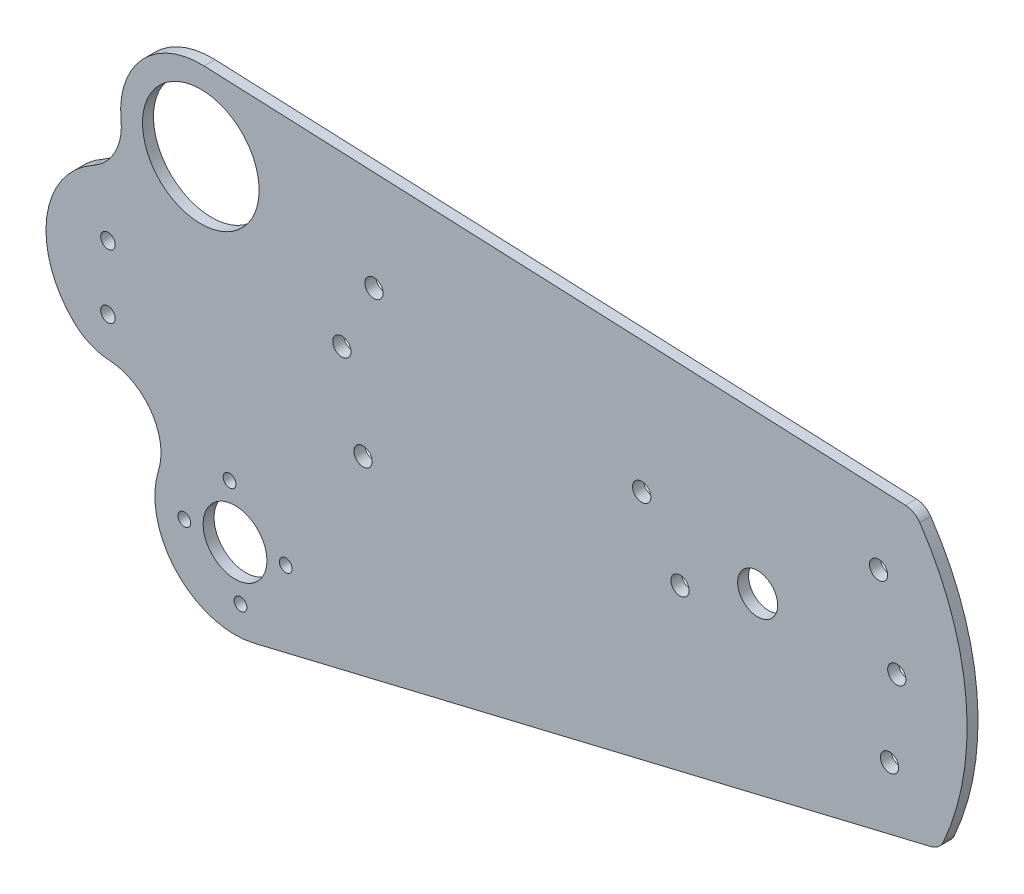
ISO-10303-21;
HEADER;
FILE_DESCRIPTION(('STEP AP214'),'2;1');
FILE_NAME('part.step','',(''),(''),'','','');
FILE_SCHEMA(('AUTOMOTIVE_DESIGN { 1 0 10303 214 1 1 1 1 }'));
ENDSEC;
DATA;
#1=APPLICATION_CONTEXT('core data for automotive mechanical design processes');
#2=APPLICATION_PROTOCOL_DEFINITION('international standard','automotive_design',2000,#1);
#3=PRODUCT_CONTEXT('',#1,'mechanical');
#4=PRODUCT('Part','Part','',(#3));
#5=PRODUCT_RELATED_PRODUCT_CATEGORY('part','',(#4));
#6=PRODUCT_DEFINITION_FORMATION('','',#4);
#7=PRODUCT_DEFINITION_CONTEXT('part definition',#1,'design');
#8=PRODUCT_DEFINITION('design','',#6,#7);
#9=PRODUCT_DEFINITION_SHAPE('','',#8);
#10=(LENGTH_UNIT() NAMED_UNIT(*) SI_UNIT(.MILLI.,.METRE.));
#11=(NAMED_UNIT(*) PLANE_ANGLE_UNIT() SI_UNIT($,.RADIAN.));
#12=(NAMED_UNIT(*) SI_UNIT($,.STERADIAN.) SOLID_ANGLE_UNIT());
#13=UNCERTAINTY_MEASURE_WITH_UNIT(LENGTH_MEASURE(1.E-05),#10,'distance_accuracy_value','');
#14=(GEOMETRIC_REPRESENTATION_CONTEXT(3) GLOBAL_UNCERTAINTY_ASSIGNED_CONTEXT((#13)) GLOBAL_UNIT_ASSIGNED_CONTEXT((#10,
#11,#12)) REPRESENTATION_CONTEXT('',''));
#15=CARTESIAN_POINT('',(0.,0.,0.));
#16=DIRECTION('',(0.,0.,1.));
#17=DIRECTION('',(1.,0.,0.));
#18=AXIS2_PLACEMENT_3D('',#15,#16,#17);
#19=CARTESIAN_POINT('',(1.89364443510684,44.6553291473657,3.));
#20=DIRECTION('',(0.0423677115411601,0.999102085384054,0.));
#21=DIRECTION('',(-0.999102085384054,0.0423677115411601,0.));
#22=AXIS2_PLACEMENT_3D('',#19,#20,#21);
#23=PLANE('',#22);
#24=DIRECTION('',(0.999102085384054,-0.0423677115411601,0.));
#25=VECTOR('',#24,1.);
#26=CARTESIAN_POINT('',(1.89364443510684,44.6553291473657,0.));
#27=LINE('',#26,#25);
#28=CARTESIAN_POINT('',(-111.886028633776,49.4802458784492,0.));
#29=VERTEX_POINT('',#28);
#30=CARTESIAN_POINT('',(80.5949546406806,41.3179380464159,0.));
#31=VERTEX_POINT('',#30);
#32=EDGE_CURVE('E226',#29,#31,#27,.T.);
#33=ORIENTED_EDGE('',*,*,#32,.F.);
#34=DIRECTION('',(0.,0.,-1.));
#35=VECTOR('',#34,1.);
#36=CARTESIAN_POINT('',(-111.886028633776,49.4802458784492,3.));
#37=LINE('',#36,#35);
#38=CARTESIAN_POINT('',(-111.886028633776,49.4802458784492,3.));
#39=VERTEX_POINT('',#38);
#40=EDGE_CURVE('E11',#39,#29,#37,.T.);
#41=ORIENTED_EDGE('',*,*,#40,.F.);
#42=DIRECTION('',(0.999102085384054,-0.0423677115411601,0.));
#43=VECTOR('',#42,1.);
#44=CARTESIAN_POINT('',(1.89364443510684,44.6553291473657,3.));
#45=LINE('',#44,#43);
#46=CARTESIAN_POINT('',(80.5949546406806,41.3179380464159,3.));
#47=VERTEX_POINT('',#46);
#48=EDGE_CURVE('E330',#39,#47,#45,.T.);
#49=ORIENTED_EDGE('',*,*,#48,.T.);
#50=DIRECTION('',(0.,0.,-1.));
#51=VECTOR('',#50,1.);
#52=CARTESIAN_POINT('',(80.5949546406806,41.3179380464159,3.));
#53=LINE('',#52,#51);
#54=EDGE_CURVE('E102',#47,#31,#53,.T.);
#55=ORIENTED_EDGE('',*,*,#54,.T.);
#56=EDGE_LOOP('',(#33,#41,#49,#55));
#57=FACE_BOUND('',#56,.T.);
#58=ADVANCED_FACE('F41',(#57),#23,.T.);
#59=CARTESIAN_POINT('',(-112.818118287682,27.5,3.));
#60=DIRECTION('',(0.,0.,-1.));
#61=DIRECTION('',(-1.,0.,0.));
#62=AXIS2_PLACEMENT_3D('',#59,#60,#61);
#63=CYLINDRICAL_SURFACE('',#62,22.);
#64=CARTESIAN_POINT('',(-112.818118287682,27.5,0.));
#65=DIRECTION('',(0.,0.,1.));
#66=DIRECTION('',(1.,0.,0.));
#67=AXIS2_PLACEMENT_3D('',#64,#65,#66);
#68=CIRCLE('',#67,22.);
#69=CARTESIAN_POINT('',(-134.705774542285,25.2795262486732,0.));
#70=VERTEX_POINT('',#69);
#71=EDGE_CURVE('E230',#29,#70,#68,.T.);
#72=ORIENTED_EDGE('',*,*,#71,.T.);
#73=DIRECTION('',(0.,0.,-1.));
#74=VECTOR('',#73,1.);
#75=CARTESIAN_POINT('',(-134.705774542285,25.2795262486732,3.));
#76=LINE('',#75,#74);
#77=CARTESIAN_POINT('',(-134.705774542285,25.2795262486732,3.));
#78=VERTEX_POINT('',#77);
#79=EDGE_CURVE('E50',#78,#70,#76,.T.);
#80=ORIENTED_EDGE('',*,*,#79,.F.);
#81=CARTESIAN_POINT('',(-112.818118287682,27.5,3.));
#82=DIRECTION('',(0.,0.,1.));
#83=DIRECTION('',(1.,0.,0.));
#84=AXIS2_PLACEMENT_3D('',#81,#82,#83);
#85=CIRCLE('',#84,22.);
#86=EDGE_CURVE('E405',#39,#78,#85,.T.);
#87=ORIENTED_EDGE('',*,*,#86,.F.);
#88=ORIENTED_EDGE('',*,*,#40,.T.);
#89=EDGE_LOOP('',(#72,#80,#87,#88));
#90=FACE_BOUND('',#89,.T.);
#91=ADVANCED_FACE('F363',(#90),#63,.T.);
#92=CARTESIAN_POINT('',(-149.62917653406,23.7655668727686,3.));
#93=DIRECTION('',(0.,0.,-1.));
#94=DIRECTION('',(-1.,0.,0.));
#95=AXIS2_PLACEMENT_3D('',#92,#93,#94);
#96=CYLINDRICAL_SURFACE('',#95,15.);
#97=CARTESIAN_POINT('',(-149.62917653406,23.7655668727686,0.));
#98=DIRECTION('',(0.,0.,1.));
#99=DIRECTION('',(1.,0.,0.));
#100=AXIS2_PLACEMENT_3D('',#97,#98,#99);
#101=CIRCLE('',#100,15.);
#102=CARTESIAN_POINT('',(-142.382746132034,10.6320507240518,0.));
#103=VERTEX_POINT('',#102);
#104=EDGE_CURVE('E234',#103,#70,#101,.T.);
#105=ORIENTED_EDGE('',*,*,#104,.F.);
#106=DIRECTION('',(0.,0.,-1.));
#107=VECTOR('',#106,1.);
#108=CARTESIAN_POINT('',(-142.382746132034,10.6320507240518,3.));
#109=LINE('',#108,#107);
#110=CARTESIAN_POINT('',(-142.382746132034,10.6320507240518,3.));
#111=VERTEX_POINT('',#110);
#112=EDGE_CURVE('E351',#111,#103,#109,.T.);
#113=ORIENTED_EDGE('',*,*,#112,.F.);
#114=CARTESIAN_POINT('',(-149.62917653406,23.7655668727686,3.));
#115=DIRECTION('',(0.,0.,1.));
#116=DIRECTION('',(1.,0.,0.));
#117=AXIS2_PLACEMENT_3D('',#114,#115,#116);
#118=CIRCLE('',#117,15.);
#119=EDGE_CURVE('E360',#111,#78,#118,.T.);
#120=ORIENTED_EDGE('',*,*,#119,.T.);
#121=ORIENTED_EDGE('',*,*,#79,.T.);
#122=EDGE_LOOP('',(#105,#113,#120,#121));
#123=FACE_BOUND('',#122,.T.);
#124=ADVANCED_FACE('F358',(#123),#96,.F.);
#125=CARTESIAN_POINT('',(-130.305362128659,-11.2571428571429,3.));
#126=DIRECTION('',(0.,0.,-1.));
#127=DIRECTION('',(-1.,0.,0.));
#128=AXIS2_PLACEMENT_3D('',#125,#126,#127);
#129=CYLINDRICAL_SURFACE('',#128,25.);
#130=CARTESIAN_POINT('',(-130.305362128659,-11.2571428571429,0.));
#131=DIRECTION('',(0.,0.,1.));
#132=DIRECTION('',(1.,0.,0.));
#133=AXIS2_PLACEMENT_3D('',#130,#131,#132);
#134=CIRCLE('',#133,25.);
#135=CARTESIAN_POINT('',(-147.542861296201,-29.3642857142857,0.));
#136=VERTEX_POINT('',#135);
#137=EDGE_CURVE('E238',#103,#136,#134,.T.);
#138=ORIENTED_EDGE('',*,*,#137,.T.);
#139=DIRECTION('',(0.,0.,-1.));
#140=VECTOR('',#139,1.);
#141=CARTESIAN_POINT('',(-147.542861296201,-29.3642857142857,3.));
#142=LINE('',#141,#140);
#143=CARTESIAN_POINT('',(-147.542861296201,-29.3642857142857,3.));
#144=VERTEX_POINT('',#143);
#145=EDGE_CURVE('E347',#144,#136,#142,.T.);
#146=ORIENTED_EDGE('',*,*,#145,.F.);
#147=CARTESIAN_POINT('',(-130.305362128659,-11.2571428571429,3.));
#148=DIRECTION('',(0.,0.,1.));
#149=DIRECTION('',(1.,0.,0.));
#150=AXIS2_PLACEMENT_3D('',#147,#148,#149);
#151=CIRCLE('',#150,25.);
#152=EDGE_CURVE('E382',#111,#144,#151,.T.);
#153=ORIENTED_EDGE('',*,*,#152,.F.);
#154=ORIENTED_EDGE('',*,*,#112,.T.);
#155=EDGE_LOOP('',(#138,#146,#153,#154));
#156=FACE_BOUND('',#155,.T.);
#157=ADVANCED_FACE('F371',(#156),#129,.T.);
#158=CARTESIAN_POINT('',(-137.200361795676,-18.5,3.));
#159=DIRECTION('',(0.,0.,-1.));
#160=DIRECTION('',(-1.,0.,0.));
#161=AXIS2_PLACEMENT_3D('',#158,#159,#160);
#162=CYLINDRICAL_SURFACE('',#161,15.);
#163=CARTESIAN_POINT('',(-137.200361795676,-18.5,0.));
#164=DIRECTION('',(0.,0.,1.));
#165=DIRECTION('',(1.,0.,0.));
#166=AXIS2_PLACEMENT_3D('',#163,#164,#165);
#167=CIRCLE('',#166,15.);
#168=CARTESIAN_POINT('',(-137.970351553493,-33.4802241562955,0.));
#169=VERTEX_POINT('',#168);
#170=EDGE_CURVE('E241',#136,#169,#167,.T.);
#171=ORIENTED_EDGE('',*,*,#170,.T.);
#172=DIRECTION('',(0.,0.,-1.));
#173=VECTOR('',#172,1.);
#174=CARTESIAN_POINT('',(-137.970351553493,-33.4802241562955,3.));
#175=LINE('',#174,#173);
#176=CARTESIAN_POINT('',(-137.970351553493,-33.4802241562955,3.));
#177=VERTEX_POINT('',#176);
#178=EDGE_CURVE('E344',#177,#169,#175,.T.);
#179=ORIENTED_EDGE('',*,*,#178,.F.);
#180=CARTESIAN_POINT('',(-137.200361795676,-18.5,3.));
#181=DIRECTION('',(0.,0.,1.));
#182=DIRECTION('',(1.,0.,0.));
#183=AXIS2_PLACEMENT_3D('',#180,#181,#182);
#184=CIRCLE('',#183,15.);
#185=EDGE_CURVE('E377',#144,#177,#184,.T.);
#186=ORIENTED_EDGE('',*,*,#185,.F.);
#187=ORIENTED_EDGE('',*,*,#145,.T.);
#188=EDGE_LOOP('',(#171,#179,#186,#187));
#189=FACE_BOUND('',#188,.T.);
#190=ADVANCED_FACE('F375',(#189),#162,.T.);
#191=CARTESIAN_POINT('',(-138.740341311309,-48.4604483125909,3.));
#192=DIRECTION('',(0.,0.,-1.));
#193=DIRECTION('',(-1.,0.,0.));
#194=AXIS2_PLACEMENT_3D('',#191,#192,#193);
#195=CYLINDRICAL_SURFACE('',#194,15.);
#196=CARTESIAN_POINT('',(-138.740341311309,-48.4604483125909,0.));
#197=DIRECTION('',(0.,0.,1.));
#198=DIRECTION('',(1.,0.,0.));
#199=AXIS2_PLACEMENT_3D('',#196,#197,#198);
#200=CIRCLE('',#199,15.);
#201=CARTESIAN_POINT('',(-124.422839539333,-52.9336063703251,0.));
#202=VERTEX_POINT('',#201);
#203=EDGE_CURVE('E245',#202,#169,#200,.T.);
#204=ORIENTED_EDGE('',*,*,#203,.F.);
#205=DIRECTION('',(0.,0.,-1.));
#206=VECTOR('',#205,1.);
#207=CARTESIAN_POINT('',(-124.422839539333,-52.9336063703251,3.));
#208=LINE('',#207,#206);
#209=CARTESIAN_POINT('',(-124.422839539333,-52.9336063703251,3.));
#210=VERTEX_POINT('',#209);
#211=EDGE_CURVE('E341',#210,#202,#208,.T.);
#212=ORIENTED_EDGE('',*,*,#211,.F.);
#213=CARTESIAN_POINT('',(-138.740341311309,-48.4604483125909,3.));
#214=DIRECTION('',(0.,0.,1.));
#215=DIRECTION('',(1.,0.,0.));
#216=AXIS2_PLACEMENT_3D('',#213,#214,#215);
#217=CIRCLE('',#216,15.);
#218=EDGE_CURVE('E381',#210,#177,#217,.T.);
#219=ORIENTED_EDGE('',*,*,#218,.T.);
#220=ORIENTED_EDGE('',*,*,#178,.T.);
#221=EDGE_LOOP('',(#204,#212,#219,#220));
#222=FACE_BOUND('',#221,.T.);
#223=ADVANCED_FACE('F423',(#222),#195,.F.);
#224=CARTESIAN_POINT('',(-103.423836940436,-59.4942381883351,3.));
#225=DIRECTION('',(0.,0.,-1.));
#226=DIRECTION('',(-1.,0.,0.));
#227=AXIS2_PLACEMENT_3D('',#224,#225,#226);
#228=CYLINDRICAL_SURFACE('',#227,22.);
#229=CARTESIAN_POINT('',(-103.423836940436,-59.4942381883351,0.));
#230=DIRECTION('',(0.,0.,1.));
#231=DIRECTION('',(1.,0.,0.));
#232=AXIS2_PLACEMENT_3D('',#229,#230,#231);
#233=CIRCLE('',#232,22.);
#234=CARTESIAN_POINT('',(-98.2951635897501,-80.8880856604933,0.));
#235=VERTEX_POINT('',#234);
#236=EDGE_CURVE('E249',#202,#235,#233,.T.);
#237=ORIENTED_EDGE('',*,*,#236,.T.);
#238=DIRECTION('',(0.,0.,-1.));
#239=VECTOR('',#238,1.);
#240=CARTESIAN_POINT('',(-98.2951635897501,-80.8880856604933,3.));
#241=LINE('',#240,#239);
#242=CARTESIAN_POINT('',(-98.2951635897501,-80.8880856604933,3.));
#243=VERTEX_POINT('',#242);
#244=EDGE_CURVE('E337',#243,#235,#241,.T.);
#245=ORIENTED_EDGE('',*,*,#244,.F.);
#246=CARTESIAN_POINT('',(-103.423836940436,-59.4942381883351,3.));
#247=DIRECTION('',(0.,0.,1.));
#248=DIRECTION('',(1.,0.,0.));
#249=AXIS2_PLACEMENT_3D('',#246,#247,#248);
#250=CIRCLE('',#249,22.);
#251=EDGE_CURVE('E386',#210,#243,#250,.T.);
#252=ORIENTED_EDGE('',*,*,#251,.F.);
#253=ORIENTED_EDGE('',*,*,#211,.T.);
#254=EDGE_LOOP('',(#237,#245,#252,#253));
#255=FACE_BOUND('',#254,.T.);
#256=ADVANCED_FACE('F396',(#255),#228,.T.);
#257=CARTESIAN_POINT('',(12.9952908868623,-54.2088084148887,3.));
#258=DIRECTION('',(-0.233121515940252,0.972447612370825,0.));
#259=DIRECTION('',(-0.972447612370825,-0.233121515940252,0.));
#260=AXIS2_PLACEMENT_3D('',#257,#258,#259);
#261=PLANE('',#260);
#262=DIRECTION('',(0.972447612370825,0.233121515940252,0.));
#263=VECTOR('',#262,1.);
#264=CARTESIAN_POINT('',(12.9952908868623,-54.2088084148887,0.));
#265=LINE('',#264,#263);
#266=CARTESIAN_POINT('',(87.5998610393009,-36.3241118319993,0.));
#267=VERTEX_POINT('',#266);
#268=EDGE_CURVE('E252',#235,#267,#265,.T.);
#269=ORIENTED_EDGE('',*,*,#268,.T.);
#270=DIRECTION('',(0.,0.,-1.));
#271=VECTOR('',#270,1.);
#272=CARTESIAN_POINT('',(87.5998610393009,-36.3241118319993,3.));
#273=LINE('',#272,#271);
#274=CARTESIAN_POINT('',(87.5998610393009,-36.3241118319993,3.));
#275=VERTEX_POINT('',#274);
#276=EDGE_CURVE('E148',#275,#267,#273,.T.);
#277=ORIENTED_EDGE('',*,*,#276,.F.);
#278=DIRECTION('',(0.972447612370825,0.233121515940252,0.));
#279=VECTOR('',#278,1.);
#280=CARTESIAN_POINT('',(12.9952908868623,-54.2088084148887,3.));
#281=LINE('',#280,#279);
#282=EDGE_CURVE('E137',#243,#275,#281,.T.);
#283=ORIENTED_EDGE('',*,*,#282,.F.);
#284=ORIENTED_EDGE('',*,*,#244,.T.);
#285=EDGE_LOOP('',(#269,#277,#283,#284));
#286=FACE_BOUND('',#285,.T.);
#287=ADVANCED_FACE('F400',(#286),#261,.F.);
#288=CARTESIAN_POINT('',(86.4342534595996,-31.4618737701452,3.));
#289=DIRECTION('',(0.,0.,-1.));
#290=DIRECTION('',(-1.,0.,0.));
#291=AXIS2_PLACEMENT_3D('',#288,#289,#290);
#292=CYLINDRICAL_SURFACE('',#291,4.99999999999999);
#293=CARTESIAN_POINT('',(86.4342534595996,-31.4618737701452,0.));
#294=DIRECTION('',(0.,0.,1.));
#295=DIRECTION('',(1.,0.,0.));
#296=AXIS2_PLACEMENT_3D('',#293,#294,#295);
#297=CIRCLE('',#296,4.99999999999999);
#298=CARTESIAN_POINT('',(91.,-33.5,0.));
#299=VERTEX_POINT('',#298);
#300=EDGE_CURVE('E146',#267,#299,#297,.T.);
#301=ORIENTED_EDGE('',*,*,#300,.T.);
#302=DIRECTION('',(0.,0.,-1.));
#303=VECTOR('',#302,1.);
#304=CARTESIAN_POINT('',(91.,-33.5,3.));
#305=LINE('',#304,#303);
#306=CARTESIAN_POINT('',(91.,-33.5,3.));
#307=VERTEX_POINT('',#306);
#308=EDGE_CURVE('E143',#307,#299,#305,.T.);
#309=ORIENTED_EDGE('',*,*,#308,.F.);
#310=CARTESIAN_POINT('',(86.4342534595996,-31.4618737701452,3.));
#311=DIRECTION('',(0.,0.,1.));
#312=DIRECTION('',(1.,0.,0.));
#313=AXIS2_PLACEMENT_3D('',#310,#311,#312);
#314=CIRCLE('',#313,4.99999999999999);
#315=EDGE_CURVE('E130',#275,#307,#314,.T.);
#316=ORIENTED_EDGE('',*,*,#315,.F.);
#317=ORIENTED_EDGE('',*,*,#276,.T.);
#318=EDGE_LOOP('',(#301,#309,#316,#317));
#319=FACE_BOUND('',#318,.T.);
#320=ADVANCED_FACE('F144',(#319),#292,.T.);
#321=CARTESIAN_POINT('',(22.6589151875398,-2.99288439458776,3.));
#322=DIRECTION('',(0.,0.,-1.));
#323=DIRECTION('',(-1.,0.,0.));
#324=AXIS2_PLACEMENT_3D('',#321,#322,#323);
#325=CYLINDRICAL_SURFACE('',#324,74.8410848124603);
#326=CARTESIAN_POINT('',(22.6589151875398,-2.99288439458776,0.));
#327=DIRECTION('',(0.,0.,1.));
#328=DIRECTION('',(1.,0.,0.));
#329=AXIS2_PLACEMENT_3D('',#326,#327,#328);
#330=CIRCLE('',#329,74.8410848124603);
#331=CARTESIAN_POINT('',(84.5156550498621,39.1370540044991,0.));
#332=VERTEX_POINT('',#331);
#333=EDGE_CURVE('E95',#299,#332,#330,.T.);
#334=ORIENTED_EDGE('',*,*,#333,.T.);
#335=DIRECTION('',(0.,0.,-1.));
#336=VECTOR('',#335,1.);
#337=CARTESIAN_POINT('',(84.5156550498621,39.1370540044991,3.));
#338=LINE('',#337,#336);
#339=CARTESIAN_POINT('',(84.5156550498621,39.1370540044991,3.));
#340=VERTEX_POINT('',#339);
#341=EDGE_CURVE('E149',#340,#332,#338,.T.);
#342=ORIENTED_EDGE('',*,*,#341,.F.);
#343=CARTESIAN_POINT('',(22.6589151875398,-2.99288439458776,3.));
#344=DIRECTION('',(0.,0.,1.));
#345=DIRECTION('',(1.,0.,0.));
#346=AXIS2_PLACEMENT_3D('',#343,#344,#345);
#347=CIRCLE('',#346,74.8410848124603);
#348=EDGE_CURVE('E135',#307,#340,#347,.T.);
#349=ORIENTED_EDGE('',*,*,#348,.F.);
#350=ORIENTED_EDGE('',*,*,#308,.T.);
#351=EDGE_LOOP('',(#334,#342,#349,#350));
#352=FACE_BOUND('',#351,.T.);
#353=ADVANCED_FACE('F151',(#352),#325,.T.);
#354=CARTESIAN_POINT('',(-101.920751924876,-73.4133162984688,3.));
#355=DIRECTION('',(0.,0.,-1.));
#356=DIRECTION('',(-1.,0.,0.));
#357=AXIS2_PLACEMENT_3D('',#354,#355,#356);
#358=CYLINDRICAL_SURFACE('',#357,1.75);
#359=CARTESIAN_POINT('',(-101.920751924876,-73.4133162984688,3.));
#360=DIRECTION('',(0.,0.,1.));
#361=DIRECTION('',(1.,0.,0.));
#362=AXIS2_PLACEMENT_3D('',#359,#360,#361);
#363=CIRCLE('',#362,1.75);
#364=CARTESIAN_POINT('',(-100.170751924876,-73.4133162984688,3.));
#365=VERTEX_POINT('',#364);
#366=EDGE_CURVE('E218',#365,#365,#363,.T.);
#367=ORIENTED_EDGE('',*,*,#366,.T.);
#368=EDGE_LOOP('',(#367));
#369=FACE_BOUND('',#368,.T.);
#370=CARTESIAN_POINT('',(-101.920751924876,-73.4133162984688,0.));
#371=DIRECTION('',(0.,0.,1.));
#372=DIRECTION('',(1.,0.,0.));
#373=AXIS2_PLACEMENT_3D('',#370,#371,#372);
#374=CIRCLE('',#373,1.75);
#375=CARTESIAN_POINT('',(-100.170751924876,-73.4133162984688,0.));
#376=VERTEX_POINT('',#375);
#377=EDGE_CURVE('E322',#376,#376,#374,.T.);
#378=ORIENTED_EDGE('',*,*,#377,.F.);
#379=EDGE_LOOP('',(#378));
#380=FACE_BOUND('',#379,.T.);
#381=ADVANCED_FACE('F435',(#369,#380),#358,.F.);
#382=CARTESIAN_POINT('',(-89.504758830302,-57.9911531727758,3.));
#383=DIRECTION('',(0.,0.,-1.));
#384=DIRECTION('',(-1.,0.,0.));
#385=AXIS2_PLACEMENT_3D('',#382,#383,#384);
#386=CYLINDRICAL_SURFACE('',#385,1.74999999999997);
#387=CARTESIAN_POINT('',(-89.504758830302,-57.9911531727758,3.));
#388=DIRECTION('',(0.,0.,1.));
#389=DIRECTION('',(1.,0.,0.));
#390=AXIS2_PLACEMENT_3D('',#387,#388,#389);
#391=CIRCLE('',#390,1.74999999999997);
#392=CARTESIAN_POINT('',(-87.754758830302,-57.9911531727758,3.));
#393=VERTEX_POINT('',#392);
#394=EDGE_CURVE('E214',#393,#393,#391,.T.);
#395=ORIENTED_EDGE('',*,*,#394,.T.);
#396=EDGE_LOOP('',(#395));
#397=FACE_BOUND('',#396,.T.);
#398=CARTESIAN_POINT('',(-89.504758830302,-57.9911531727758,0.));
#399=DIRECTION('',(0.,0.,1.));
#400=DIRECTION('',(1.,0.,0.));
#401=AXIS2_PLACEMENT_3D('',#398,#399,#400);
#402=CIRCLE('',#401,1.74999999999997);
#403=CARTESIAN_POINT('',(-87.754758830302,-57.9911531727758,0.));
#404=VERTEX_POINT('',#403);
#405=EDGE_CURVE('E318',#404,#404,#402,.T.);
#406=ORIENTED_EDGE('',*,*,#405,.F.);
#407=EDGE_LOOP('',(#406));
#408=FACE_BOUND('',#407,.T.);
#409=ADVANCED_FACE('F494',(#397,#408),#386,.F.);
#410=CARTESIAN_POINT('',(-104.926921955995,-45.5751600782015,3.));
#411=DIRECTION('',(0.,0.,-1.));
#412=DIRECTION('',(-1.,0.,0.));
#413=AXIS2_PLACEMENT_3D('',#410,#411,#412);
#414=CYLINDRICAL_SURFACE('',#413,1.74999999999998);
#415=CARTESIAN_POINT('',(-104.926921955995,-45.5751600782015,3.));
#416=DIRECTION('',(0.,0.,1.));
#417=DIRECTION('',(1.,0.,0.));
#418=AXIS2_PLACEMENT_3D('',#415,#416,#417);
#419=CIRCLE('',#418,1.74999999999998);
#420=CARTESIAN_POINT('',(-103.176921955995,-45.5751600782015,3.));
#421=VERTEX_POINT('',#420);
#422=EDGE_CURVE('E210',#421,#421,#419,.T.);
#423=ORIENTED_EDGE('',*,*,#422,.T.);
#424=EDGE_LOOP('',(#423));
#425=FACE_BOUND('',#424,.T.);
#426=CARTESIAN_POINT('',(-104.926921955995,-45.5751600782015,0.));
#427=DIRECTION('',(0.,0.,1.));
#428=DIRECTION('',(1.,0.,0.));
#429=AXIS2_PLACEMENT_3D('',#426,#427,#428);
#430=CIRCLE('',#429,1.74999999999998);
#431=CARTESIAN_POINT('',(-103.176921955995,-45.5751600782015,0.));
#432=VERTEX_POINT('',#431);
#433=EDGE_CURVE('E314',#432,#432,#430,.T.);
#434=ORIENTED_EDGE('',*,*,#433,.F.);
#435=EDGE_LOOP('',(#434));
#436=FACE_BOUND('',#435,.T.);
#437=ADVANCED_FACE('F490',(#425,#436),#414,.F.);
#438=CARTESIAN_POINT('',(-103.423836940436,-59.4942381883351,3.));
#439=DIRECTION('',(0.,0.,-1.));
#440=DIRECTION('',(-1.,0.,0.));
#441=AXIS2_PLACEMENT_3D('',#438,#439,#440);
#442=CYLINDRICAL_SURFACE('',#441,8.75000000000001);
#443=CARTESIAN_POINT('',(-103.423836940436,-59.4942381883351,3.));
#444=DIRECTION('',(0.,0.,1.));
#445=DIRECTION('',(1.,0.,0.));
#446=AXIS2_PLACEMENT_3D('',#443,#444,#445);
#447=CIRCLE('',#446,8.75000000000001);
#448=CARTESIAN_POINT('',(-94.6738369404356,-59.4942381883351,3.));
#449=VERTEX_POINT('',#448);
#450=EDGE_CURVE('E206',#449,#449,#447,.T.);
#451=ORIENTED_EDGE('',*,*,#450,.T.);
#452=EDGE_LOOP('',(#451));
#453=FACE_BOUND('',#452,.T.);
#454=CARTESIAN_POINT('',(-103.423836940436,-59.4942381883351,0.));
#455=DIRECTION('',(0.,0.,1.));
#456=DIRECTION('',(1.,0.,0.));
#457=AXIS2_PLACEMENT_3D('',#454,#455,#456);
#458=CIRCLE('',#457,8.75000000000001);
#459=CARTESIAN_POINT('',(-94.6738369404356,-59.4942381883351,0.));
#460=VERTEX_POINT('',#459);
#461=EDGE_CURVE('E310',#460,#460,#458,.T.);
#462=ORIENTED_EDGE('',*,*,#461,.F.);
#463=EDGE_LOOP('',(#462));
#464=FACE_BOUND('',#463,.T.);
#465=ADVANCED_FACE('F486',(#453,#464),#442,.F.);
#466=CARTESIAN_POINT('',(-112.818118287682,27.5,3.));
#467=DIRECTION('',(0.,0.,-1.));
#468=DIRECTION('',(-1.,0.,0.));
#469=AXIS2_PLACEMENT_3D('',#466,#467,#468);
#470=CYLINDRICAL_SURFACE('',#469,16.);
#471=CARTESIAN_POINT('',(-112.818118287682,27.5,3.));
#472=DIRECTION('',(0.,0.,1.));
#473=DIRECTION('',(1.,0.,0.));
#474=AXIS2_PLACEMENT_3D('',#471,#472,#473);
#475=CIRCLE('',#474,16.);
#476=CARTESIAN_POINT('',(-96.8181182876816,27.5,3.));
#477=VERTEX_POINT('',#476);
#478=EDGE_CURVE('E202',#477,#477,#475,.T.);
#479=ORIENTED_EDGE('',*,*,#478,.T.);
#480=EDGE_LOOP('',(#479));
#481=FACE_BOUND('',#480,.T.);
#482=CARTESIAN_POINT('',(-112.818118287682,27.5,0.));
#483=DIRECTION('',(0.,0.,1.));
#484=DIRECTION('',(1.,0.,0.));
#485=AXIS2_PLACEMENT_3D('',#482,#483,#484);
#486=CIRCLE('',#485,16.);
#487=CARTESIAN_POINT('',(-96.8181182876816,27.5,0.));
#488=VERTEX_POINT('',#487);
#489=EDGE_CURVE('E306',#488,#488,#486,.T.);
#490=ORIENTED_EDGE('',*,*,#489,.F.);
#491=EDGE_LOOP('',(#490));
#492=FACE_BOUND('',#491,.T.);
#493=ADVANCED_FACE('F482',(#481,#492),#470,.F.);
#494=CARTESIAN_POINT('',(-68.3,-21.5,3.));
#495=DIRECTION('',(0.,0.,-1.));
#496=DIRECTION('',(-1.,0.,0.));
#497=AXIS2_PLACEMENT_3D('',#494,#495,#496);
#498=CYLINDRICAL_SURFACE('',#497,2.49999999999999);
#499=CARTESIAN_POINT('',(-68.3,-21.5,3.));
#500=DIRECTION('',(0.,0.,1.));
#501=DIRECTION('',(1.,0.,0.));
#502=AXIS2_PLACEMENT_3D('',#499,#500,#501);
#503=CIRCLE('',#502,2.49999999999999);
#504=CARTESIAN_POINT('',(-65.8,-21.5,3.));
#505=VERTEX_POINT('',#504);
#506=EDGE_CURVE('E198',#505,#505,#503,.T.);
#507=ORIENTED_EDGE('',*,*,#506,.T.);
#508=EDGE_LOOP('',(#507));
#509=FACE_BOUND('',#508,.T.);
#510=CARTESIAN_POINT('',(-68.3,-21.5,0.));
#511=DIRECTION('',(0.,0.,1.));
#512=DIRECTION('',(1.,0.,0.));
#513=AXIS2_PLACEMENT_3D('',#510,#511,#512);
#514=CIRCLE('',#513,2.49999999999999);
#515=CARTESIAN_POINT('',(-65.8,-21.5,0.));
#516=VERTEX_POINT('',#515);
#517=EDGE_CURVE('E302',#516,#516,#514,.T.);
#518=ORIENTED_EDGE('',*,*,#517,.F.);
#519=EDGE_LOOP('',(#518));
#520=FACE_BOUND('',#519,.T.);
#521=ADVANCED_FACE('F478',(#509,#520),#498,.F.);
#522=CARTESIAN_POINT('',(-138.3,-5.25000000000004,3.));
#523=DIRECTION('',(0.,0.,-1.));
#524=DIRECTION('',(-1.,0.,0.));
#525=AXIS2_PLACEMENT_3D('',#522,#523,#524);
#526=CYLINDRICAL_SURFACE('',#525,2.);
#527=CARTESIAN_POINT('',(-138.3,-5.25000000000004,3.));
#528=DIRECTION('',(0.,0.,1.));
#529=DIRECTION('',(1.,0.,0.));
#530=AXIS2_PLACEMENT_3D('',#527,#528,#529);
#531=CIRCLE('',#530,2.);
#532=CARTESIAN_POINT('',(-136.3,-5.25000000000004,3.));
#533=VERTEX_POINT('',#532);
#534=EDGE_CURVE('E194',#533,#533,#531,.T.);
#535=ORIENTED_EDGE('',*,*,#534,.T.);
#536=EDGE_LOOP('',(#535));
#537=FACE_BOUND('',#536,.T.);
#538=CARTESIAN_POINT('',(-138.3,-5.25000000000004,0.));
#539=DIRECTION('',(0.,0.,1.));
#540=DIRECTION('',(1.,0.,0.));
#541=AXIS2_PLACEMENT_3D('',#538,#539,#540);
#542=CIRCLE('',#541,2.);
#543=CARTESIAN_POINT('',(-136.3,-5.25000000000004,0.));
#544=VERTEX_POINT('',#543);
#545=EDGE_CURVE('E298',#544,#544,#542,.T.);
#546=ORIENTED_EDGE('',*,*,#545,.F.);
#547=EDGE_LOOP('',(#546));
#548=FACE_BOUND('',#547,.T.);
#549=ADVANCED_FACE('F474',(#537,#548),#526,.F.);
#550=CARTESIAN_POINT('',(-138.3,-22.75,3.));
#551=DIRECTION('',(0.,0.,-1.));
#552=DIRECTION('',(-1.,0.,0.));
#553=AXIS2_PLACEMENT_3D('',#550,#551,#552);
#554=CYLINDRICAL_SURFACE('',#553,2.);
#555=CARTESIAN_POINT('',(-138.3,-22.75,3.));
#556=DIRECTION('',(0.,0.,1.));
#557=DIRECTION('',(1.,0.,0.));
#558=AXIS2_PLACEMENT_3D('',#555,#556,#557);
#559=CIRCLE('',#558,2.);
#560=CARTESIAN_POINT('',(-136.3,-22.75,3.));
#561=VERTEX_POINT('',#560);
#562=EDGE_CURVE('E190',#561,#561,#559,.T.);
#563=ORIENTED_EDGE('',*,*,#562,.T.);
#564=EDGE_LOOP('',(#563));
#565=FACE_BOUND('',#564,.T.);
#566=CARTESIAN_POINT('',(-138.3,-22.75,0.));
#567=DIRECTION('',(0.,0.,1.));
#568=DIRECTION('',(1.,0.,0.));
#569=AXIS2_PLACEMENT_3D('',#566,#567,#568);
#570=CIRCLE('',#569,2.);
#571=CARTESIAN_POINT('',(-136.3,-22.75,0.));
#572=VERTEX_POINT('',#571);
#573=EDGE_CURVE('E294',#572,#572,#570,.T.);
#574=ORIENTED_EDGE('',*,*,#573,.F.);
#575=EDGE_LOOP('',(#574));
#576=FACE_BOUND('',#575,.T.);
#577=ADVANCED_FACE('F470',(#565,#576),#554,.F.);
#578=CARTESIAN_POINT('',(-74.1,1.7,3.));
#579=DIRECTION('',(0.,0.,-1.));
#580=DIRECTION('',(-1.,0.,0.));
#581=AXIS2_PLACEMENT_3D('',#578,#579,#580);
#582=CYLINDRICAL_SURFACE('',#581,2.49999999999999);
#583=CARTESIAN_POINT('',(-74.1,1.7,3.));
#584=DIRECTION('',(0.,0.,1.));
#585=DIRECTION('',(1.,0.,0.));
#586=AXIS2_PLACEMENT_3D('',#583,#584,#585);
#587=CIRCLE('',#586,2.49999999999999);
#588=CARTESIAN_POINT('',(-71.6,1.7,3.));
#589=VERTEX_POINT('',#588);
#590=EDGE_CURVE('E186',#589,#589,#587,.T.);
#591=ORIENTED_EDGE('',*,*,#590,.T.);
#592=EDGE_LOOP('',(#591));
#593=FACE_BOUND('',#592,.T.);
#594=CARTESIAN_POINT('',(-74.1,1.7,0.));
#595=DIRECTION('',(0.,0.,1.));
#596=DIRECTION('',(1.,0.,0.));
#597=AXIS2_PLACEMENT_3D('',#594,#595,#596);
#598=CIRCLE('',#597,2.49999999999999);
#599=CARTESIAN_POINT('',(-71.6,1.7,0.));
#600=VERTEX_POINT('',#599);
#601=EDGE_CURVE('E290',#600,#600,#598,.T.);
#602=ORIENTED_EDGE('',*,*,#601,.F.);
#603=EDGE_LOOP('',(#602));
#604=FACE_BOUND('',#603,.T.);
#605=ADVANCED_FACE('F466',(#593,#604),#582,.F.);
#606=CARTESIAN_POINT('',(-65.3,20.,3.));
#607=DIRECTION('',(0.,0.,-1.));
#608=DIRECTION('',(-1.,0.,0.));
#609=AXIS2_PLACEMENT_3D('',#606,#607,#608);
#610=CYLINDRICAL_SURFACE('',#609,2.50000000000001);
#611=CARTESIAN_POINT('',(-65.3,20.,3.));
#612=DIRECTION('',(0.,0.,1.));
#613=DIRECTION('',(1.,0.,0.));
#614=AXIS2_PLACEMENT_3D('',#611,#612,#613);
#615=CIRCLE('',#614,2.50000000000001);
#616=CARTESIAN_POINT('',(-62.8,20.,3.));
#617=VERTEX_POINT('',#616);
#618=EDGE_CURVE('E182',#617,#617,#615,.T.);
#619=ORIENTED_EDGE('',*,*,#618,.T.);
#620=EDGE_LOOP('',(#619));
#621=FACE_BOUND('',#620,.T.);
#622=CARTESIAN_POINT('',(-65.3,20.,0.));
#623=DIRECTION('',(0.,0.,1.));
#624=DIRECTION('',(1.,0.,0.));
#625=AXIS2_PLACEMENT_3D('',#622,#623,#624);
#626=CIRCLE('',#625,2.50000000000001);
#627=CARTESIAN_POINT('',(-62.8,20.,0.));
#628=VERTEX_POINT('',#627);
#629=EDGE_CURVE('E286',#628,#628,#626,.T.);
#630=ORIENTED_EDGE('',*,*,#629,.F.);
#631=EDGE_LOOP('',(#630));
#632=FACE_BOUND('',#631,.T.);
#633=ADVANCED_FACE('F462',(#621,#632),#610,.F.);
#634=CARTESIAN_POINT('',(76.2,-22.,3.));
#635=DIRECTION('',(0.,0.,-1.));
#636=DIRECTION('',(-1.,0.,0.));
#637=AXIS2_PLACEMENT_3D('',#634,#635,#636);
#638=CYLINDRICAL_SURFACE('',#637,2.5);
#639=CARTESIAN_POINT('',(76.2,-22.,3.));
#640=DIRECTION('',(0.,0.,1.));
#641=DIRECTION('',(1.,0.,0.));
#642=AXIS2_PLACEMENT_3D('',#639,#640,#641);
#643=CIRCLE('',#642,2.5);
#644=CARTESIAN_POINT('',(78.7,-22.,3.));
#645=VERTEX_POINT('',#644);
#646=EDGE_CURVE('E178',#645,#645,#643,.T.);
#647=ORIENTED_EDGE('',*,*,#646,.T.);
#648=EDGE_LOOP('',(#647));
#649=FACE_BOUND('',#648,.T.);
#650=CARTESIAN_POINT('',(76.2,-22.,0.));
#651=DIRECTION('',(0.,0.,1.));
#652=DIRECTION('',(1.,0.,0.));
#653=AXIS2_PLACEMENT_3D('',#650,#651,#652);
#654=CIRCLE('',#653,2.5);
#655=CARTESIAN_POINT('',(78.7,-22.,0.));
#656=VERTEX_POINT('',#655);
#657=EDGE_CURVE('E282',#656,#656,#654,.T.);
#658=ORIENTED_EDGE('',*,*,#657,.F.);
#659=EDGE_LOOP('',(#658));
#660=FACE_BOUND('',#659,.T.);
#661=ADVANCED_FACE('F458',(#649,#660),#638,.F.);
#662=CARTESIAN_POINT('',(73.2,22.3,3.));
#663=DIRECTION('',(0.,0.,-1.));
#664=DIRECTION('',(-1.,0.,0.));
#665=AXIS2_PLACEMENT_3D('',#662,#663,#664);
#666=CYLINDRICAL_SURFACE('',#665,2.50000000000001);
#667=CARTESIAN_POINT('',(73.2,22.3,3.));
#668=DIRECTION('',(0.,0.,1.));
#669=DIRECTION('',(1.,0.,0.));
#670=AXIS2_PLACEMENT_3D('',#667,#668,#669);
#671=CIRCLE('',#670,2.50000000000001);
#672=CARTESIAN_POINT('',(75.7000000000001,22.3,3.));
#673=VERTEX_POINT('',#672);
#674=EDGE_CURVE('E174',#673,#673,#671,.T.);
#675=ORIENTED_EDGE('',*,*,#674,.T.);
#676=EDGE_LOOP('',(#675));
#677=FACE_BOUND('',#676,.T.);
#678=CARTESIAN_POINT('',(73.2,22.3,0.));
#679=DIRECTION('',(0.,0.,1.));
#680=DIRECTION('',(1.,0.,0.));
#681=AXIS2_PLACEMENT_3D('',#678,#679,#680);
#682=CIRCLE('',#681,2.50000000000001);
#683=CARTESIAN_POINT('',(75.7000000000001,22.3,0.));
#684=VERTEX_POINT('',#683);
#685=EDGE_CURVE('E278',#684,#684,#682,.T.);
#686=ORIENTED_EDGE('',*,*,#685,.F.);
#687=EDGE_LOOP('',(#686));
#688=FACE_BOUND('',#687,.T.);
#689=ADVANCED_FACE('F454',(#677,#688),#666,.F.);
#690=CARTESIAN_POINT('',(78.2,-0.100000000000003,3.));
#691=DIRECTION('',(0.,0.,-1.));
#692=DIRECTION('',(-1.,0.,0.));
#693=AXIS2_PLACEMENT_3D('',#690,#691,#692);
#694=CYLINDRICAL_SURFACE('',#693,2.5);
#695=CARTESIAN_POINT('',(78.2,-0.100000000000003,3.));
#696=DIRECTION('',(0.,0.,1.));
#697=DIRECTION('',(1.,0.,0.));
#698=AXIS2_PLACEMENT_3D('',#695,#696,#697);
#699=CIRCLE('',#698,2.5);
#700=CARTESIAN_POINT('',(80.7,-0.100000000000003,3.));
#701=VERTEX_POINT('',#700);
#702=EDGE_CURVE('E170',#701,#701,#699,.T.);
#703=ORIENTED_EDGE('',*,*,#702,.T.);
#704=EDGE_LOOP('',(#703));
#705=FACE_BOUND('',#704,.T.);
#706=CARTESIAN_POINT('',(78.2,-0.100000000000003,0.));
#707=DIRECTION('',(0.,0.,1.));
#708=DIRECTION('',(1.,0.,0.));
#709=AXIS2_PLACEMENT_3D('',#706,#707,#708);
#710=CIRCLE('',#709,2.5);
#711=CARTESIAN_POINT('',(80.7,-0.100000000000003,0.));
#712=VERTEX_POINT('',#711);
#713=EDGE_CURVE('E274',#712,#712,#710,.T.);
#714=ORIENTED_EDGE('',*,*,#713,.F.);
#715=EDGE_LOOP('',(#714));
#716=FACE_BOUND('',#715,.T.);
#717=ADVANCED_FACE('F450',(#705,#716),#694,.F.);
#718=CARTESIAN_POINT('',(18.7,-8.7,3.));
#719=DIRECTION('',(0.,0.,-1.));
#720=DIRECTION('',(-1.,0.,0.));
#721=AXIS2_PLACEMENT_3D('',#718,#719,#720);
#722=CYLINDRICAL_SURFACE('',#721,2.5);
#723=CARTESIAN_POINT('',(18.7,-8.7,3.));
#724=DIRECTION('',(0.,0.,1.));
#725=DIRECTION('',(1.,0.,0.));
#726=AXIS2_PLACEMENT_3D('',#723,#724,#725);
#727=CIRCLE('',#726,2.5);
#728=CARTESIAN_POINT('',(21.2,-8.7,3.));
#729=VERTEX_POINT('',#728);
#730=EDGE_CURVE('E166',#729,#729,#727,.T.);
#731=ORIENTED_EDGE('',*,*,#730,.T.);
#732=EDGE_LOOP('',(#731));
#733=FACE_BOUND('',#732,.T.);
#734=CARTESIAN_POINT('',(18.7,-8.7,0.));
#735=DIRECTION('',(0.,0.,1.));
#736=DIRECTION('',(1.,0.,0.));
#737=AXIS2_PLACEMENT_3D('',#734,#735,#736);
#738=CIRCLE('',#737,2.5);
#739=CARTESIAN_POINT('',(21.2,-8.7,0.));
#740=VERTEX_POINT('',#739);
#741=EDGE_CURVE('E270',#740,#740,#738,.T.);
#742=ORIENTED_EDGE('',*,*,#741,.F.);
#743=EDGE_LOOP('',(#742));
#744=FACE_BOUND('',#743,.T.);
#745=ADVANCED_FACE('F446',(#733,#744),#722,.F.);
#746=CARTESIAN_POINT('',(8.20000000000003,8.3,3.));
#747=DIRECTION('',(0.,0.,-1.));
#748=DIRECTION('',(-1.,0.,0.));
#749=AXIS2_PLACEMENT_3D('',#746,#747,#748);
#750=CYLINDRICAL_SURFACE('',#749,2.5);
#751=CARTESIAN_POINT('',(8.20000000000003,8.3,3.));
#752=DIRECTION('',(0.,0.,1.));
#753=DIRECTION('',(1.,0.,0.));
#754=AXIS2_PLACEMENT_3D('',#751,#752,#753);
#755=CIRCLE('',#754,2.5);
#756=CARTESIAN_POINT('',(10.7,8.3,3.));
#757=VERTEX_POINT('',#756);
#758=EDGE_CURVE('E162',#757,#757,#755,.T.);
#759=ORIENTED_EDGE('',*,*,#758,.T.);
#760=EDGE_LOOP('',(#759));
#761=FACE_BOUND('',#760,.T.);
#762=CARTESIAN_POINT('',(8.20000000000003,8.3,0.));
#763=DIRECTION('',(0.,0.,1.));
#764=DIRECTION('',(1.,0.,0.));
#765=AXIS2_PLACEMENT_3D('',#762,#763,#764);
#766=CIRCLE('',#765,2.5);
#767=CARTESIAN_POINT('',(10.7,8.3,0.));
#768=VERTEX_POINT('',#767);
#769=EDGE_CURVE('E266',#768,#768,#766,.T.);
#770=ORIENTED_EDGE('',*,*,#769,.F.);
#771=EDGE_LOOP('',(#770));
#772=FACE_BOUND('',#771,.T.);
#773=ADVANCED_FACE('F442',(#761,#772),#750,.F.);
#774=CARTESIAN_POINT('',(40.0177822723635,0.,3.));
#775=DIRECTION('',(0.,0.,-1.));
#776=DIRECTION('',(-1.,0.,0.));
#777=AXIS2_PLACEMENT_3D('',#774,#775,#776);
#778=CYLINDRICAL_SURFACE('',#777,5.5);
#779=CARTESIAN_POINT('',(40.0177822723635,0.,3.));
#780=DIRECTION('',(0.,0.,1.));
#781=DIRECTION('',(1.,0.,0.));
#782=AXIS2_PLACEMENT_3D('',#779,#780,#781);
#783=CIRCLE('',#782,5.5);
#784=CARTESIAN_POINT('',(45.5177822723635,0.,3.));
#785=VERTEX_POINT('',#784);
#786=EDGE_CURVE('E155',#785,#785,#783,.T.);
#787=ORIENTED_EDGE('',*,*,#786,.T.);
#788=EDGE_LOOP('',(#787));
#789=FACE_BOUND('',#788,.T.);
#790=CARTESIAN_POINT('',(40.0177822723635,0.,0.));
#791=DIRECTION('',(0.,0.,1.));
#792=DIRECTION('',(1.,0.,0.));
#793=AXIS2_PLACEMENT_3D('',#790,#791,#792);
#794=CIRCLE('',#793,5.5);
#795=CARTESIAN_POINT('',(45.5177822723635,0.,0.));
#796=VERTEX_POINT('',#795);
#797=EDGE_CURVE('E262',#796,#796,#794,.T.);
#798=ORIENTED_EDGE('',*,*,#797,.F.);
#799=EDGE_LOOP('',(#798));
#800=FACE_BOUND('',#799,.T.);
#801=ADVANCED_FACE('F439',(#789,#800),#778,.F.);
#802=CARTESIAN_POINT('',(80.3831160829748,36.3224276194956,3.));
#803=DIRECTION('',(0.,0.,-1.));
#804=DIRECTION('',(-1.,0.,0.));
#805=AXIS2_PLACEMENT_3D('',#802,#803,#804);
#806=CYLINDRICAL_SURFACE('',#805,5.);
#807=CARTESIAN_POINT('',(80.3831160829748,36.3224276194956,0.));
#808=DIRECTION('',(0.,0.,1.));
#809=DIRECTION('',(1.,0.,0.));
#810=AXIS2_PLACEMENT_3D('',#807,#808,#809);
#811=CIRCLE('',#810,5.);
#812=EDGE_CURVE('E259',#332,#31,#811,.T.);
#813=ORIENTED_EDGE('',*,*,#812,.T.);
#814=ORIENTED_EDGE('',*,*,#54,.F.);
#815=CARTESIAN_POINT('',(80.3831160829748,36.3224276194956,3.));
#816=DIRECTION('',(0.,0.,1.));
#817=DIRECTION('',(1.,0.,0.));
#818=AXIS2_PLACEMENT_3D('',#815,#816,#817);
#819=CIRCLE('',#818,5.);
#820=EDGE_CURVE('E58',#340,#47,#819,.T.);
#821=ORIENTED_EDGE('',*,*,#820,.F.);
#822=ORIENTED_EDGE('',*,*,#341,.T.);
#823=EDGE_LOOP('',(#813,#814,#821,#822));
#824=FACE_BOUND('',#823,.T.);
#825=ADVANCED_FACE('F403',(#824),#806,.T.);
#826=CARTESIAN_POINT('',(-117.342915050569,-60.9973232038945,3.));
#827=DIRECTION('',(0.,0.,-1.));
#828=DIRECTION('',(-1.,0.,0.));
#829=AXIS2_PLACEMENT_3D('',#826,#827,#828);
#830=CYLINDRICAL_SURFACE('',#829,1.75000000000001);
#831=CARTESIAN_POINT('',(-117.342915050569,-60.9973232038945,3.));
#832=DIRECTION('',(0.,0.,1.));
#833=DIRECTION('',(1.,0.,0.));
#834=AXIS2_PLACEMENT_3D('',#831,#832,#833);
#835=CIRCLE('',#834,1.75000000000001);
#836=CARTESIAN_POINT('',(-115.592915050569,-60.9973232038945,3.));
#837=VERTEX_POINT('',#836);
#838=EDGE_CURVE('E222',#837,#837,#835,.T.);
#839=ORIENTED_EDGE('',*,*,#838,.T.);
#840=EDGE_LOOP('',(#839));
#841=FACE_BOUND('',#840,.T.);
#842=CARTESIAN_POINT('',(-117.342915050569,-60.9973232038945,0.));
#843=DIRECTION('',(0.,0.,1.));
#844=DIRECTION('',(1.,0.,0.));
#845=AXIS2_PLACEMENT_3D('',#842,#843,#844);
#846=CIRCLE('',#845,1.75000000000001);
#847=CARTESIAN_POINT('',(-115.592915050569,-60.9973232038945,0.));
#848=VERTEX_POINT('',#847);
#849=EDGE_CURVE('E326',#848,#848,#846,.T.);
#850=ORIENTED_EDGE('',*,*,#849,.F.);
#851=EDGE_LOOP('',(#850));
#852=FACE_BOUND('',#851,.T.);
#853=ADVANCED_FACE('F438',(#841,#852),#830,.F.);
#854=CARTESIAN_POINT('',(0.,0.,3.));
#855=DIRECTION('',(0.,0.,1.));
#856=DIRECTION('',(1.,0.,0.));
#857=AXIS2_PLACEMENT_3D('',#854,#855,#856);
#858=PLANE('',#857);
#859=ORIENTED_EDGE('',*,*,#48,.F.);
#860=ORIENTED_EDGE('',*,*,#86,.T.);
#861=ORIENTED_EDGE('',*,*,#119,.F.);
#862=ORIENTED_EDGE('',*,*,#152,.T.);
#863=ORIENTED_EDGE('',*,*,#185,.T.);
#864=ORIENTED_EDGE('',*,*,#218,.F.);
#865=ORIENTED_EDGE('',*,*,#251,.T.);
#866=ORIENTED_EDGE('',*,*,#282,.T.);
#867=ORIENTED_EDGE('',*,*,#315,.T.);
#868=ORIENTED_EDGE('',*,*,#348,.T.);
#869=ORIENTED_EDGE('',*,*,#820,.T.);
#870=EDGE_LOOP('',(#859,#860,#861,#862,#863,#864,#865,#866,#867,#868,#869));
#871=FACE_BOUND('',#870,.T.);
#872=ORIENTED_EDGE('',*,*,#786,.F.);
#873=EDGE_LOOP('',(#872));
#874=FACE_BOUND('',#873,.T.);
#875=ORIENTED_EDGE('',*,*,#758,.F.);
#876=EDGE_LOOP('',(#875));
#877=FACE_BOUND('',#876,.T.);
#878=ORIENTED_EDGE('',*,*,#730,.F.);
#879=EDGE_LOOP('',(#878));
#880=FACE_BOUND('',#879,.T.);
#881=ORIENTED_EDGE('',*,*,#702,.F.);
#882=EDGE_LOOP('',(#881));
#883=FACE_BOUND('',#882,.T.);
#884=ORIENTED_EDGE('',*,*,#674,.F.);
#885=EDGE_LOOP('',(#884));
#886=FACE_BOUND('',#885,.T.);
#887=ORIENTED_EDGE('',*,*,#646,.F.);
#888=EDGE_LOOP('',(#887));
#889=FACE_BOUND('',#888,.T.);
#890=ORIENTED_EDGE('',*,*,#618,.F.);
#891=EDGE_LOOP('',(#890));
#892=FACE_BOUND('',#891,.T.);
#893=ORIENTED_EDGE('',*,*,#590,.F.);
#894=EDGE_LOOP('',(#893));
#895=FACE_BOUND('',#894,.T.);
#896=ORIENTED_EDGE('',*,*,#562,.F.);
#897=EDGE_LOOP('',(#896));
#898=FACE_BOUND('',#897,.T.);
#899=ORIENTED_EDGE('',*,*,#534,.F.);
#900=EDGE_LOOP('',(#899));
#901=FACE_BOUND('',#900,.T.);
#902=ORIENTED_EDGE('',*,*,#506,.F.);
#903=EDGE_LOOP('',(#902));
#904=FACE_BOUND('',#903,.T.);
#905=ORIENTED_EDGE('',*,*,#478,.F.);
#906=EDGE_LOOP('',(#905));
#907=FACE_BOUND('',#906,.T.);
#908=ORIENTED_EDGE('',*,*,#450,.F.);
#909=EDGE_LOOP('',(#908));
#910=FACE_BOUND('',#909,.T.);
#911=ORIENTED_EDGE('',*,*,#422,.F.);
#912=EDGE_LOOP('',(#911));
#913=FACE_BOUND('',#912,.T.);
#914=ORIENTED_EDGE('',*,*,#394,.F.);
#915=EDGE_LOOP('',(#914));
#916=FACE_BOUND('',#915,.T.);
#917=ORIENTED_EDGE('',*,*,#366,.F.);
#918=EDGE_LOOP('',(#917));
#919=FACE_BOUND('',#918,.T.);
#920=ORIENTED_EDGE('',*,*,#838,.F.);
#921=EDGE_LOOP('',(#920));
#922=FACE_BOUND('',#921,.T.);
#923=ADVANCED_FACE('F132',(#871,#874,#877,#880,#883,#886,#889,#892,#895,#898,#901,#904,#907,
#910,#913,#916,#919,#922),#858,.T.);
#924=CARTESIAN_POINT('',(0.,0.,0.));
#925=DIRECTION('',(0.,0.,1.));
#926=DIRECTION('',(1.,0.,0.));
#927=AXIS2_PLACEMENT_3D('',#924,#925,#926);
#928=PLANE('',#927);
#929=ORIENTED_EDGE('',*,*,#32,.T.);
#930=ORIENTED_EDGE('',*,*,#812,.F.);
#931=ORIENTED_EDGE('',*,*,#333,.F.);
#932=ORIENTED_EDGE('',*,*,#300,.F.);
#933=ORIENTED_EDGE('',*,*,#268,.F.);
#934=ORIENTED_EDGE('',*,*,#236,.F.);
#935=ORIENTED_EDGE('',*,*,#203,.T.);
#936=ORIENTED_EDGE('',*,*,#170,.F.);
#937=ORIENTED_EDGE('',*,*,#137,.F.);
#938=ORIENTED_EDGE('',*,*,#104,.T.);
#939=ORIENTED_EDGE('',*,*,#71,.F.);
#940=EDGE_LOOP('',(#929,#930,#931,#932,#933,#934,#935,#936,#937,#938,#939));
#941=FACE_BOUND('',#940,.T.);
#942=ORIENTED_EDGE('',*,*,#797,.T.);
#943=EDGE_LOOP('',(#942));
#944=FACE_BOUND('',#943,.T.);
#945=ORIENTED_EDGE('',*,*,#769,.T.);
#946=EDGE_LOOP('',(#945));
#947=FACE_BOUND('',#946,.T.);
#948=ORIENTED_EDGE('',*,*,#741,.T.);
#949=EDGE_LOOP('',(#948));
#950=FACE_BOUND('',#949,.T.);
#951=ORIENTED_EDGE('',*,*,#713,.T.);
#952=EDGE_LOOP('',(#951));
#953=FACE_BOUND('',#952,.T.);
#954=ORIENTED_EDGE('',*,*,#685,.T.);
#955=EDGE_LOOP('',(#954));
#956=FACE_BOUND('',#955,.T.);
#957=ORIENTED_EDGE('',*,*,#657,.T.);
#958=EDGE_LOOP('',(#957));
#959=FACE_BOUND('',#958,.T.);
#960=ORIENTED_EDGE('',*,*,#629,.T.);
#961=EDGE_LOOP('',(#960));
#962=FACE_BOUND('',#961,.T.);
#963=ORIENTED_EDGE('',*,*,#601,.T.);
#964=EDGE_LOOP('',(#963));
#965=FACE_BOUND('',#964,.T.);
#966=ORIENTED_EDGE('',*,*,#573,.T.);
#967=EDGE_LOOP('',(#966));
#968=FACE_BOUND('',#967,.T.);
#969=ORIENTED_EDGE('',*,*,#545,.T.);
#970=EDGE_LOOP('',(#969));
#971=FACE_BOUND('',#970,.T.);
#972=ORIENTED_EDGE('',*,*,#517,.T.);
#973=EDGE_LOOP('',(#972));
#974=FACE_BOUND('',#973,.T.);
#975=ORIENTED_EDGE('',*,*,#489,.T.);
#976=EDGE_LOOP('',(#975));
#977=FACE_BOUND('',#976,.T.);
#978=ORIENTED_EDGE('',*,*,#461,.T.);
#979=EDGE_LOOP('',(#978));
#980=FACE_BOUND('',#979,.T.);
#981=ORIENTED_EDGE('',*,*,#433,.T.);
#982=EDGE_LOOP('',(#981));
#983=FACE_BOUND('',#982,.T.);
#984=ORIENTED_EDGE('',*,*,#405,.T.);
#985=EDGE_LOOP('',(#984));
#986=FACE_BOUND('',#985,.T.);
#987=ORIENTED_EDGE('',*,*,#377,.T.);
#988=EDGE_LOOP('',(#987));
#989=FACE_BOUND('',#988,.T.);
#990=ORIENTED_EDGE('',*,*,#849,.T.);
#991=EDGE_LOOP('',(#990));
#992=FACE_BOUND('',#991,.T.);
#993=ADVANCED_FACE('F366',(#941,#944,#947,#950,#953,#956,#959,#962,#965,#968,#971,#974,#977,
#980,#983,#986,#989,#992),#928,.F.);
#994=CLOSED_SHELL('',(#58,#91,#124,#157,#190,#223,#256,#287,#320,#353,#381,#409,#437,#465,#493,
#521,#549,#577,#605,#633,#661,#689,#717,#745,#773,#801,#825,#853,#923,#993));
#995=MANIFOLD_SOLID_BREP('B2',#994);
#996=ADVANCED_BREP_SHAPE_REPRESENTATION('',(#18,#995),#14);
#997=SHAPE_DEFINITION_REPRESENTATION(#9,#996);
ENDSEC;
END-ISO-10303-21;
